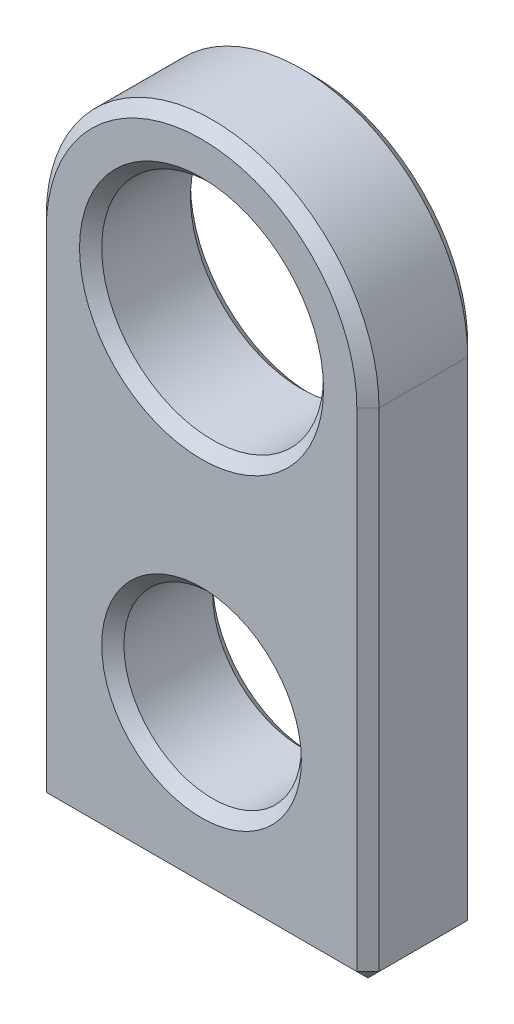
ISO-10303-21;
HEADER;
FILE_DESCRIPTION(('STEP AP214'),'2;1');
FILE_NAME('part.step','',(''),(''),'','','');
FILE_SCHEMA(('AUTOMOTIVE_DESIGN { 1 0 10303 214 1 1 1 1 }'));
ENDSEC;
DATA;
#1=APPLICATION_CONTEXT('core data for automotive mechanical design processes');
#2=APPLICATION_PROTOCOL_DEFINITION('international standard','automotive_design',2000,#1);
#3=PRODUCT_CONTEXT('',#1,'mechanical');
#4=PRODUCT('Part','Part','',(#3));
#5=PRODUCT_RELATED_PRODUCT_CATEGORY('part','',(#4));
#6=PRODUCT_DEFINITION_FORMATION('','',#4);
#7=PRODUCT_DEFINITION_CONTEXT('part definition',#1,'design');
#8=PRODUCT_DEFINITION('design','',#6,#7);
#9=PRODUCT_DEFINITION_SHAPE('','',#8);
#10=(LENGTH_UNIT() NAMED_UNIT(*) SI_UNIT(.MILLI.,.METRE.));
#11=(NAMED_UNIT(*) PLANE_ANGLE_UNIT() SI_UNIT($,.RADIAN.));
#12=(NAMED_UNIT(*) SI_UNIT($,.STERADIAN.) SOLID_ANGLE_UNIT());
#13=UNCERTAINTY_MEASURE_WITH_UNIT(LENGTH_MEASURE(1.E-05),#10,'distance_accuracy_value','');
#14=(GEOMETRIC_REPRESENTATION_CONTEXT(3) GLOBAL_UNCERTAINTY_ASSIGNED_CONTEXT((#13)) GLOBAL_UNIT_ASSIGNED_CONTEXT((#10,
#11,#12)) REPRESENTATION_CONTEXT('',''));
#15=CARTESIAN_POINT('',(0.,0.,0.));
#16=DIRECTION('',(0.,0.,1.));
#17=DIRECTION('',(1.,0.,0.));
#18=AXIS2_PLACEMENT_3D('',#15,#16,#17);
#19=CARTESIAN_POINT('',(0.,-60.0355059831991,0.));
#20=DIRECTION('',(-1.,0.,0.));
#21=DIRECTION('',(0.,0.,1.));
#22=AXIS2_PLACEMENT_3D('',#19,#20,#21);
#23=PLANE('',#22);
#24=DIRECTION('',(0.,-1.,0.));
#25=VECTOR('',#24,1.);
#26=CARTESIAN_POINT('',(0.,-61.1738801234898,4.5));
#27=LINE('',#26,#25);
#28=CARTESIAN_POINT('',(0.,-52.5355059831991,4.5));
#29=VERTEX_POINT('',#28);
#30=CARTESIAN_POINT('',(0.,-74.5355059831991,4.5));
#31=VERTEX_POINT('',#30);
#32=EDGE_CURVE('E205',#29,#31,#27,.T.);
#33=ORIENTED_EDGE('',*,*,#32,.F.);
#34=DIRECTION('',(0.,0.,1.));
#35=VECTOR('',#34,1.);
#36=CARTESIAN_POINT('',(0.,-52.5355059831991,0.));
#37=LINE('',#36,#35);
#38=CARTESIAN_POINT('',(0.,-52.5355059831991,0.5));
#39=VERTEX_POINT('',#38);
#40=EDGE_CURVE('E279',#39,#29,#37,.T.);
#41=ORIENTED_EDGE('',*,*,#40,.F.);
#42=DIRECTION('',(0.,1.,0.));
#43=VECTOR('',#42,1.);
#44=CARTESIAN_POINT('',(0.,-61.1738801234898,0.5));
#45=LINE('',#44,#43);
#46=CARTESIAN_POINT('',(0.,-74.5355059831991,0.5));
#47=VERTEX_POINT('',#46);
#48=EDGE_CURVE('E230',#47,#39,#45,.T.);
#49=ORIENTED_EDGE('',*,*,#48,.F.);
#50=DIRECTION('',(0.,0.,-1.));
#51=VECTOR('',#50,1.);
#52=CARTESIAN_POINT('',(0.,-74.5355059831991,0.));
#53=LINE('',#52,#51);
#54=EDGE_CURVE('E246',#31,#47,#53,.T.);
#55=ORIENTED_EDGE('',*,*,#54,.F.);
#56=EDGE_LOOP('',(#33,#41,#49,#55));
#57=FACE_BOUND('',#56,.T.);
#58=ADVANCED_FACE('F17',(#57),#23,.T.);
#59=CARTESIAN_POINT('',(7.5,-52.5355059831991,4.75));
#60=DIRECTION('',(0.,0.,1.));
#61=DIRECTION('',(-1.,0.,0.));
#62=AXIS2_PLACEMENT_3D('',#59,#60,#61);
#63=CONICAL_SURFACE('',#62,5.25,0.7853981634);
#64=CARTESIAN_POINT('',(7.5,-52.5355059831991,5.));
#65=DIRECTION('',(0.,0.,1.));
#66=DIRECTION('',(-1.,0.,0.));
#67=AXIS2_PLACEMENT_3D('',#64,#65,#66);
#68=CIRCLE('',#67,5.5);
#69=CARTESIAN_POINT('',(13.,-52.5355059831991,5.));
#70=VERTEX_POINT('',#69);
#71=EDGE_CURVE('E306',#70,#70,#68,.T.);
#72=ORIENTED_EDGE('',*,*,#71,.T.);
#73=EDGE_LOOP('',(#72));
#74=FACE_BOUND('',#73,.T.);
#75=CARTESIAN_POINT('',(7.5,-52.5355059831991,4.5));
#76=DIRECTION('',(0.,0.,-1.));
#77=DIRECTION('',(-1.,0.,0.));
#78=AXIS2_PLACEMENT_3D('',#75,#76,#77);
#79=CIRCLE('',#78,5.);
#80=CARTESIAN_POINT('',(12.5,-52.5355059831991,4.5));
#81=VERTEX_POINT('',#80);
#82=EDGE_CURVE('E11',#81,#81,#79,.T.);
#83=ORIENTED_EDGE('',*,*,#82,.T.);
#84=EDGE_LOOP('',(#83));
#85=FACE_BOUND('',#84,.T.);
#86=ADVANCED_FACE('F340',(#74,#85),#63,.F.);
#87=CARTESIAN_POINT('',(7.5,-52.5355059831991,0.));
#88=DIRECTION('',(0.,0.,1.));
#89=DIRECTION('',(-1.,0.,0.));
#90=AXIS2_PLACEMENT_3D('',#87,#88,#89);
#91=CYLINDRICAL_SURFACE('',#90,5.);
#92=CARTESIAN_POINT('',(7.5,-52.5355059831991,0.5));
#93=DIRECTION('',(0.,0.,1.));
#94=DIRECTION('',(-1.,0.,0.));
#95=AXIS2_PLACEMENT_3D('',#92,#93,#94);
#96=CIRCLE('',#95,5.);
#97=CARTESIAN_POINT('',(12.5,-52.5355059831991,0.5));
#98=VERTEX_POINT('',#97);
#99=EDGE_CURVE('E25',#98,#98,#96,.T.);
#100=ORIENTED_EDGE('',*,*,#99,.F.);
#101=EDGE_LOOP('',(#100));
#102=FACE_BOUND('',#101,.T.);
#103=ORIENTED_EDGE('',*,*,#82,.F.);
#104=EDGE_LOOP('',(#103));
#105=FACE_BOUND('',#104,.T.);
#106=ADVANCED_FACE('F346',(#102,#105),#91,.F.);
#107=CARTESIAN_POINT('',(7.5,-52.5355059831991,0.25));
#108=DIRECTION('',(0.,0.,-1.));
#109=DIRECTION('',(-1.,0.,0.));
#110=AXIS2_PLACEMENT_3D('',#107,#108,#109);
#111=CONICAL_SURFACE('',#110,5.25,0.7853981634);
#112=CARTESIAN_POINT('',(7.5,-52.5355059831991,0.));
#113=DIRECTION('',(0.,0.,-1.));
#114=DIRECTION('',(-1.,0.,0.));
#115=AXIS2_PLACEMENT_3D('',#112,#113,#114);
#116=CIRCLE('',#115,5.5);
#117=CARTESIAN_POINT('',(13.,-52.5355059831991,0.));
#118=VERTEX_POINT('',#117);
#119=EDGE_CURVE('E278',#118,#118,#116,.T.);
#120=ORIENTED_EDGE('',*,*,#119,.T.);
#121=EDGE_LOOP('',(#120));
#122=FACE_BOUND('',#121,.T.);
#123=ORIENTED_EDGE('',*,*,#99,.T.);
#124=EDGE_LOOP('',(#123));
#125=FACE_BOUND('',#124,.T.);
#126=ADVANCED_FACE('F335',(#122,#125),#111,.F.);
#127=CARTESIAN_POINT('',(7.5,-67.5355059831991,4.75));
#128=DIRECTION('',(0.,0.,1.));
#129=DIRECTION('',(-1.,0.,0.));
#130=AXIS2_PLACEMENT_3D('',#127,#128,#129);
#131=CONICAL_SURFACE('',#130,4.25,0.7853981634);
#132=CARTESIAN_POINT('',(7.5,-67.5355059831991,5.));
#133=DIRECTION('',(0.,0.,1.));
#134=DIRECTION('',(-1.,0.,0.));
#135=AXIS2_PLACEMENT_3D('',#132,#133,#134);
#136=CIRCLE('',#135,4.5);
#137=CARTESIAN_POINT('',(12.,-67.5355059831991,5.));
#138=VERTEX_POINT('',#137);
#139=EDGE_CURVE('E303',#138,#138,#136,.T.);
#140=ORIENTED_EDGE('',*,*,#139,.T.);
#141=EDGE_LOOP('',(#140));
#142=FACE_BOUND('',#141,.T.);
#143=CARTESIAN_POINT('',(7.5,-67.5355059831991,4.5));
#144=DIRECTION('',(0.,0.,-1.));
#145=DIRECTION('',(-1.,0.,0.));
#146=AXIS2_PLACEMENT_3D('',#143,#144,#145);
#147=CIRCLE('',#146,4.);
#148=CARTESIAN_POINT('',(11.5,-67.5355059831991,4.5));
#149=VERTEX_POINT('',#148);
#150=EDGE_CURVE('E199',#149,#149,#147,.T.);
#151=ORIENTED_EDGE('',*,*,#150,.T.);
#152=EDGE_LOOP('',(#151));
#153=FACE_BOUND('',#152,.T.);
#154=ADVANCED_FACE('F319',(#142,#153),#131,.F.);
#155=CARTESIAN_POINT('',(7.5,-67.5355059831991,0.));
#156=DIRECTION('',(0.,0.,1.));
#157=DIRECTION('',(-1.,0.,0.));
#158=AXIS2_PLACEMENT_3D('',#155,#156,#157);
#159=CYLINDRICAL_SURFACE('',#158,4.);
#160=CARTESIAN_POINT('',(7.5,-67.5355059831991,0.5));
#161=DIRECTION('',(0.,0.,1.));
#162=DIRECTION('',(-1.,0.,0.));
#163=AXIS2_PLACEMENT_3D('',#160,#161,#162);
#164=CIRCLE('',#163,4.);
#165=CARTESIAN_POINT('',(11.5,-67.5355059831991,0.5));
#166=VERTEX_POINT('',#165);
#167=EDGE_CURVE('E309',#166,#166,#164,.T.);
#168=ORIENTED_EDGE('',*,*,#167,.F.);
#169=EDGE_LOOP('',(#168));
#170=FACE_BOUND('',#169,.T.);
#171=ORIENTED_EDGE('',*,*,#150,.F.);
#172=EDGE_LOOP('',(#171));
#173=FACE_BOUND('',#172,.T.);
#174=ADVANCED_FACE('F321',(#170,#173),#159,.F.);
#175=CARTESIAN_POINT('',(7.5,-67.5355059831991,0.25));
#176=DIRECTION('',(0.,0.,-1.));
#177=DIRECTION('',(-1.,0.,0.));
#178=AXIS2_PLACEMENT_3D('',#175,#176,#177);
#179=CONICAL_SURFACE('',#178,4.25,0.7853981634);
#180=CARTESIAN_POINT('',(7.5,-67.5355059831991,0.));
#181=DIRECTION('',(0.,0.,-1.));
#182=DIRECTION('',(-1.,0.,0.));
#183=AXIS2_PLACEMENT_3D('',#180,#181,#182);
#184=CIRCLE('',#183,4.5);
#185=CARTESIAN_POINT('',(12.,-67.5355059831991,0.));
#186=VERTEX_POINT('',#185);
#187=EDGE_CURVE('E275',#186,#186,#184,.T.);
#188=ORIENTED_EDGE('',*,*,#187,.T.);
#189=EDGE_LOOP('',(#188));
#190=FACE_BOUND('',#189,.T.);
#191=ORIENTED_EDGE('',*,*,#167,.T.);
#192=EDGE_LOOP('',(#191));
#193=FACE_BOUND('',#192,.T.);
#194=ADVANCED_FACE('F323',(#190,#193),#179,.F.);
#195=CARTESIAN_POINT('',(7.5,-62.3122542637806,5.));
#196=DIRECTION('',(0.,0.,1.));
#197=DIRECTION('',(1.,0.,0.));
#198=AXIS2_PLACEMENT_3D('',#195,#196,#197);
#199=PLANE('',#198);
#200=ORIENTED_EDGE('',*,*,#71,.F.);
#201=EDGE_LOOP('',(#200));
#202=FACE_BOUND('',#201,.T.);
#203=ORIENTED_EDGE('',*,*,#139,.F.);
#204=EDGE_LOOP('',(#203));
#205=FACE_BOUND('',#204,.T.);
#206=DIRECTION('',(0.,-1.,0.));
#207=VECTOR('',#206,1.);
#208=CARTESIAN_POINT('',(14.5,-68.6738801234898,5.));
#209=LINE('',#208,#207);
#210=CARTESIAN_POINT('',(14.5,-52.5355059831991,5.));
#211=VERTEX_POINT('',#210);
#212=CARTESIAN_POINT('',(14.5,-74.5355059831991,5.));
#213=VERTEX_POINT('',#212);
#214=EDGE_CURVE('E268',#211,#213,#209,.T.);
#215=ORIENTED_EDGE('',*,*,#214,.F.);
#216=CARTESIAN_POINT('',(7.5,-52.5355059831991,5.));
#217=DIRECTION('',(0.,0.,-1.));
#218=DIRECTION('',(1.,0.,0.));
#219=AXIS2_PLACEMENT_3D('',#216,#217,#218);
#220=CIRCLE('',#219,7.);
#221=CARTESIAN_POINT('',(0.5,-52.5355059831991,5.));
#222=VERTEX_POINT('',#221);
#223=EDGE_CURVE('E206',#222,#211,#220,.T.);
#224=ORIENTED_EDGE('',*,*,#223,.F.);
#225=DIRECTION('',(0.,1.,0.));
#226=VECTOR('',#225,1.);
#227=CARTESIAN_POINT('',(0.5,-61.1738801234898,5.));
#228=LINE('',#227,#226);
#229=CARTESIAN_POINT('',(0.5,-74.5355059831991,5.));
#230=VERTEX_POINT('',#229);
#231=EDGE_CURVE('E287',#230,#222,#228,.T.);
#232=ORIENTED_EDGE('',*,*,#231,.F.);
#233=DIRECTION('',(-1.,0.,0.));
#234=VECTOR('',#233,1.);
#235=CARTESIAN_POINT('',(3.75,-74.5355059831991,5.));
#236=LINE('',#235,#234);
#237=EDGE_CURVE('E290',#213,#230,#236,.T.);
#238=ORIENTED_EDGE('',*,*,#237,.F.);
#239=EDGE_LOOP('',(#215,#224,#232,#238));
#240=FACE_BOUND('',#239,.T.);
#241=ADVANCED_FACE('F332',(#202,#205,#240),#199,.T.);
#242=CARTESIAN_POINT('',(0.,-75.0355059831991,0.));
#243=DIRECTION('',(0.,-1.,0.));
#244=DIRECTION('',(0.,0.,-1.));
#245=AXIS2_PLACEMENT_3D('',#242,#243,#244);
#246=PLANE('',#245);
#247=DIRECTION('',(-1.,0.,0.));
#248=VECTOR('',#247,1.);
#249=CARTESIAN_POINT('',(3.75,-75.0355059831991,0.5));
#250=LINE('',#249,#248);
#251=CARTESIAN_POINT('',(14.5,-75.0355059831991,0.5));
#252=VERTEX_POINT('',#251);
#253=CARTESIAN_POINT('',(0.5,-75.0355059831991,0.5));
#254=VERTEX_POINT('',#253);
#255=EDGE_CURVE('E181',#252,#254,#250,.T.);
#256=ORIENTED_EDGE('',*,*,#255,.F.);
#257=DIRECTION('',(0.,0.,-1.));
#258=VECTOR('',#257,1.);
#259=CARTESIAN_POINT('',(14.5,-75.0355059831991,0.));
#260=LINE('',#259,#258);
#261=CARTESIAN_POINT('',(14.5,-75.0355059831991,4.5));
#262=VERTEX_POINT('',#261);
#263=EDGE_CURVE('E160',#262,#252,#260,.T.);
#264=ORIENTED_EDGE('',*,*,#263,.F.);
#265=DIRECTION('',(1.,0.,0.));
#266=VECTOR('',#265,1.);
#267=CARTESIAN_POINT('',(3.75,-75.0355059831991,4.5));
#268=LINE('',#267,#266);
#269=CARTESIAN_POINT('',(0.5,-75.0355059831991,4.5));
#270=VERTEX_POINT('',#269);
#271=EDGE_CURVE('E293',#270,#262,#268,.T.);
#272=ORIENTED_EDGE('',*,*,#271,.F.);
#273=DIRECTION('',(0.,0.,1.));
#274=VECTOR('',#273,1.);
#275=CARTESIAN_POINT('',(0.5,-75.0355059831991,0.));
#276=LINE('',#275,#274);
#277=EDGE_CURVE('E249',#254,#270,#276,.T.);
#278=ORIENTED_EDGE('',*,*,#277,.F.);
#279=EDGE_LOOP('',(#256,#264,#272,#278));
#280=FACE_BOUND('',#279,.T.);
#281=ADVANCED_FACE('F376',(#280),#246,.T.);
#282=CARTESIAN_POINT('',(7.5,-62.3122542637806,0.));
#283=DIRECTION('',(0.,0.,1.));
#284=DIRECTION('',(1.,0.,0.));
#285=AXIS2_PLACEMENT_3D('',#282,#283,#284);
#286=PLANE('',#285);
#287=ORIENTED_EDGE('',*,*,#119,.F.);
#288=EDGE_LOOP('',(#287));
#289=FACE_BOUND('',#288,.T.);
#290=ORIENTED_EDGE('',*,*,#187,.F.);
#291=EDGE_LOOP('',(#290));
#292=FACE_BOUND('',#291,.T.);
#293=DIRECTION('',(1.,0.,0.));
#294=VECTOR('',#293,1.);
#295=CARTESIAN_POINT('',(3.75,-74.5355059831991,0.));
#296=LINE('',#295,#294);
#297=CARTESIAN_POINT('',(0.5,-74.5355059831991,0.));
#298=VERTEX_POINT('',#297);
#299=CARTESIAN_POINT('',(14.5,-74.5355059831991,0.));
#300=VERTEX_POINT('',#299);
#301=EDGE_CURVE('E213',#298,#300,#296,.T.);
#302=ORIENTED_EDGE('',*,*,#301,.F.);
#303=DIRECTION('',(0.,-1.,0.));
#304=VECTOR('',#303,1.);
#305=CARTESIAN_POINT('',(0.5,-61.1738801234898,0.));
#306=LINE('',#305,#304);
#307=CARTESIAN_POINT('',(0.5,-52.5355059831991,0.));
#308=VERTEX_POINT('',#307);
#309=EDGE_CURVE('E227',#308,#298,#306,.T.);
#310=ORIENTED_EDGE('',*,*,#309,.F.);
#311=CARTESIAN_POINT('',(7.5,-52.5355059831991,0.));
#312=DIRECTION('',(0.,0.,1.));
#313=DIRECTION('',(1.,0.,0.));
#314=AXIS2_PLACEMENT_3D('',#311,#312,#313);
#315=CIRCLE('',#314,7.);
#316=CARTESIAN_POINT('',(14.5,-52.5355059831991,0.));
#317=VERTEX_POINT('',#316);
#318=EDGE_CURVE('E222',#317,#308,#315,.T.);
#319=ORIENTED_EDGE('',*,*,#318,.F.);
#320=DIRECTION('',(0.,1.,0.));
#321=VECTOR('',#320,1.);
#322=CARTESIAN_POINT('',(14.5,-68.6738801234898,0.));
#323=LINE('',#322,#321);
#324=EDGE_CURVE('E172',#300,#317,#323,.T.);
#325=ORIENTED_EDGE('',*,*,#324,.F.);
#326=EDGE_LOOP('',(#302,#310,#319,#325));
#327=FACE_BOUND('',#326,.T.);
#328=ADVANCED_FACE('F383',(#289,#292,#327),#286,.F.);
#329=CARTESIAN_POINT('',(7.5,-52.5355059831991,0.));
#330=DIRECTION('',(0.,0.,1.));
#331=DIRECTION('',(1.,0.,0.));
#332=AXIS2_PLACEMENT_3D('',#329,#330,#331);
#333=CYLINDRICAL_SURFACE('',#332,7.5);
#334=CARTESIAN_POINT('',(7.5,-52.5355059831991,4.5));
#335=DIRECTION('',(0.,0.,1.));
#336=DIRECTION('',(1.,0.,0.));
#337=AXIS2_PLACEMENT_3D('',#334,#335,#336);
#338=CIRCLE('',#337,7.5);
#339=CARTESIAN_POINT('',(15.,-52.5355059831991,4.5));
#340=VERTEX_POINT('',#339);
#341=EDGE_CURVE('E201',#340,#29,#338,.T.);
#342=ORIENTED_EDGE('',*,*,#341,.F.);
#343=DIRECTION('',(0.,0.,1.));
#344=VECTOR('',#343,1.);
#345=CARTESIAN_POINT('',(15.,-52.5355059831991,0.));
#346=LINE('',#345,#344);
#347=CARTESIAN_POINT('',(15.,-52.5355059831991,0.5));
#348=VERTEX_POINT('',#347);
#349=EDGE_CURVE('E296',#348,#340,#346,.T.);
#350=ORIENTED_EDGE('',*,*,#349,.F.);
#351=CARTESIAN_POINT('',(7.5,-52.5355059831991,0.5));
#352=DIRECTION('',(0.,0.,-1.));
#353=DIRECTION('',(1.,0.,0.));
#354=AXIS2_PLACEMENT_3D('',#351,#352,#353);
#355=CIRCLE('',#354,7.5);
#356=EDGE_CURVE('E219',#39,#348,#355,.T.);
#357=ORIENTED_EDGE('',*,*,#356,.F.);
#358=ORIENTED_EDGE('',*,*,#40,.T.);
#359=EDGE_LOOP('',(#342,#350,#357,#358));
#360=FACE_BOUND('',#359,.T.);
#361=ADVANCED_FACE('F389',(#360),#333,.T.);
#362=CARTESIAN_POINT('',(15.,-75.0355059831991,0.));
#363=DIRECTION('',(1.,0.,0.));
#364=DIRECTION('',(0.,1.,0.));
#365=AXIS2_PLACEMENT_3D('',#362,#363,#364);
#366=PLANE('',#365);
#367=DIRECTION('',(0.,1.,0.));
#368=VECTOR('',#367,1.);
#369=CARTESIAN_POINT('',(15.,-68.6738801234898,4.5));
#370=LINE('',#369,#368);
#371=CARTESIAN_POINT('',(15.,-74.5355059831991,4.5));
#372=VERTEX_POINT('',#371);
#373=EDGE_CURVE('E153',#372,#340,#370,.T.);
#374=ORIENTED_EDGE('',*,*,#373,.F.);
#375=DIRECTION('',(0.,0.,1.));
#376=VECTOR('',#375,1.);
#377=CARTESIAN_POINT('',(15.,-74.5355059831991,0.));
#378=LINE('',#377,#376);
#379=CARTESIAN_POINT('',(15.,-74.5355059831991,0.5));
#380=VERTEX_POINT('',#379);
#381=EDGE_CURVE('E147',#380,#372,#378,.T.);
#382=ORIENTED_EDGE('',*,*,#381,.F.);
#383=DIRECTION('',(0.,-1.,0.));
#384=VECTOR('',#383,1.);
#385=CARTESIAN_POINT('',(15.,-68.6738801234898,0.5));
#386=LINE('',#385,#384);
#387=EDGE_CURVE('E150',#348,#380,#386,.T.);
#388=ORIENTED_EDGE('',*,*,#387,.F.);
#389=ORIENTED_EDGE('',*,*,#349,.T.);
#390=EDGE_LOOP('',(#374,#382,#388,#389));
#391=FACE_BOUND('',#390,.T.);
#392=ADVANCED_FACE('F149',(#391),#366,.T.);
#393=CARTESIAN_POINT('',(3.75,-74.7855059831991,4.75));
#394=DIRECTION('',(0.,-0.707106781186549,0.707106781186546));
#395=DIRECTION('',(-1.,0.,0.));
#396=AXIS2_PLACEMENT_3D('',#393,#394,#395);
#397=PLANE('',#396);
#398=DIRECTION('',(0.,0.707106781186546,0.707106781186549));
#399=VECTOR('',#398,1.);
#400=CARTESIAN_POINT('',(14.5,-75.0355059831991,4.5));
#401=LINE('',#400,#399);
#402=EDGE_CURVE('E253',#262,#213,#401,.T.);
#403=ORIENTED_EDGE('',*,*,#402,.T.);
#404=ORIENTED_EDGE('',*,*,#237,.T.);
#405=DIRECTION('',(0.,-0.707106781186546,-0.707106781186549));
#406=VECTOR('',#405,1.);
#407=CARTESIAN_POINT('',(0.5,-74.5355059831991,5.));
#408=LINE('',#407,#406);
#409=EDGE_CURVE('E242',#230,#270,#408,.T.);
#410=ORIENTED_EDGE('',*,*,#409,.T.);
#411=ORIENTED_EDGE('',*,*,#271,.T.);
#412=EDGE_LOOP('',(#403,#404,#410,#411));
#413=FACE_BOUND('',#412,.T.);
#414=ADVANCED_FACE('F373',(#413),#397,.T.);
#415=CARTESIAN_POINT('',(0.25,-61.1738801234898,4.75));
#416=DIRECTION('',(-0.707106781186548,0.,0.707106781186548));
#417=DIRECTION('',(0.,1.,0.));
#418=AXIS2_PLACEMENT_3D('',#415,#416,#417);
#419=PLANE('',#418);
#420=DIRECTION('',(0.707106781186546,0.,0.707106781186549));
#421=VECTOR('',#420,1.);
#422=CARTESIAN_POINT('',(0.,-52.5355059831991,4.5));
#423=LINE('',#422,#421);
#424=EDGE_CURVE('E274',#29,#222,#423,.T.);
#425=ORIENTED_EDGE('',*,*,#424,.F.);
#426=ORIENTED_EDGE('',*,*,#32,.T.);
#427=DIRECTION('',(0.707106781186548,0.,0.707106781186548));
#428=VECTOR('',#427,1.);
#429=CARTESIAN_POINT('',(0.,-74.5355059831991,4.5));
#430=LINE('',#429,#428);
#431=EDGE_CURVE('E234',#31,#230,#430,.T.);
#432=ORIENTED_EDGE('',*,*,#431,.T.);
#433=ORIENTED_EDGE('',*,*,#231,.T.);
#434=EDGE_LOOP('',(#425,#426,#432,#433));
#435=FACE_BOUND('',#434,.T.);
#436=ADVANCED_FACE('F358',(#435),#419,.T.);
#437=CARTESIAN_POINT('',(7.5,-52.5355059831991,4.75));
#438=DIRECTION('',(0.,0.,-1.));
#439=DIRECTION('',(1.,0.,0.));
#440=AXIS2_PLACEMENT_3D('',#437,#438,#439);
#441=CONICAL_SURFACE('',#440,7.25,0.785398163399998);
#442=ORIENTED_EDGE('',*,*,#424,.T.);
#443=ORIENTED_EDGE('',*,*,#223,.T.);
#444=DIRECTION('',(-0.707106781186548,0.,0.707106781186547));
#445=VECTOR('',#444,1.);
#446=CARTESIAN_POINT('',(15.,-52.5355059831991,4.5));
#447=LINE('',#446,#445);
#448=EDGE_CURVE('E159',#340,#211,#447,.T.);
#449=ORIENTED_EDGE('',*,*,#448,.F.);
#450=ORIENTED_EDGE('',*,*,#341,.T.);
#451=EDGE_LOOP('',(#442,#443,#449,#450));
#452=FACE_BOUND('',#451,.T.);
#453=ADVANCED_FACE('F356',(#452),#441,.T.);
#454=CARTESIAN_POINT('',(14.75,-68.6738801234898,4.75));
#455=DIRECTION('',(0.707106781186547,0.,0.707106781186548));
#456=DIRECTION('',(0.,-1.,0.));
#457=AXIS2_PLACEMENT_3D('',#454,#455,#456);
#458=PLANE('',#457);
#459=ORIENTED_EDGE('',*,*,#448,.T.);
#460=ORIENTED_EDGE('',*,*,#214,.T.);
#461=DIRECTION('',(0.707106781186548,0.,-0.707106781186547));
#462=VECTOR('',#461,1.);
#463=CARTESIAN_POINT('',(14.5,-74.5355059831991,5.));
#464=LINE('',#463,#462);
#465=EDGE_CURVE('E259',#213,#372,#464,.T.);
#466=ORIENTED_EDGE('',*,*,#465,.T.);
#467=ORIENTED_EDGE('',*,*,#373,.T.);
#468=EDGE_LOOP('',(#459,#460,#466,#467));
#469=FACE_BOUND('',#468,.T.);
#470=ADVANCED_FACE('F367',(#469),#458,.T.);
#471=CARTESIAN_POINT('',(14.75,-74.7855059831991,0.));
#472=DIRECTION('',(0.707106781186546,-0.707106781186549,0.));
#473=DIRECTION('',(0.,0.,-1.));
#474=AXIS2_PLACEMENT_3D('',#471,#472,#473);
#475=PLANE('',#474);
#476=DIRECTION('',(-0.707106781186549,-0.707106781186546,0.));
#477=VECTOR('',#476,1.);
#478=CARTESIAN_POINT('',(15.,-74.5355059831991,4.5));
#479=LINE('',#478,#477);
#480=EDGE_CURVE('E257',#372,#262,#479,.T.);
#481=ORIENTED_EDGE('',*,*,#480,.T.);
#482=ORIENTED_EDGE('',*,*,#263,.T.);
#483=DIRECTION('',(0.707106781186549,0.707106781186546,0.));
#484=VECTOR('',#483,1.);
#485=CARTESIAN_POINT('',(14.5,-75.0355059831991,0.5));
#486=LINE('',#485,#484);
#487=EDGE_CURVE('E177',#252,#380,#486,.T.);
#488=ORIENTED_EDGE('',*,*,#487,.T.);
#489=ORIENTED_EDGE('',*,*,#381,.T.);
#490=EDGE_LOOP('',(#481,#482,#488,#489));
#491=FACE_BOUND('',#490,.T.);
#492=ADVANCED_FACE('F183',(#491),#475,.T.);
#493=CARTESIAN_POINT('',(15.,-74.5355059831991,4.5));
#494=DIRECTION('',(0.577350269189625,-0.577350269189627,0.577350269189625));
#495=DIRECTION('',(0.,-0.707106781186546,-0.707106781186549));
#496=AXIS2_PLACEMENT_3D('',#493,#494,#495);
#497=PLANE('',#496);
#498=ORIENTED_EDGE('',*,*,#402,.F.);
#499=ORIENTED_EDGE('',*,*,#480,.F.);
#500=ORIENTED_EDGE('',*,*,#465,.F.);
#501=EDGE_LOOP('',(#498,#499,#500));
#502=FACE_BOUND('',#501,.T.);
#503=ADVANCED_FACE('F371',(#502),#497,.T.);
#504=CARTESIAN_POINT('',(0.25,-74.7855059831991,0.));
#505=DIRECTION('',(-0.707106781186546,-0.707106781186549,0.));
#506=DIRECTION('',(-0.707106781186549,0.707106781186546,0.));
#507=AXIS2_PLACEMENT_3D('',#504,#505,#506);
#508=PLANE('',#507);
#509=DIRECTION('',(-0.707106781186549,0.707106781186546,0.));
#510=VECTOR('',#509,1.);
#511=CARTESIAN_POINT('',(0.5,-75.0355059831991,4.5));
#512=LINE('',#511,#510);
#513=EDGE_CURVE('E238',#270,#31,#512,.T.);
#514=ORIENTED_EDGE('',*,*,#513,.T.);
#515=ORIENTED_EDGE('',*,*,#54,.T.);
#516=DIRECTION('',(0.707106781186549,-0.707106781186546,0.));
#517=VECTOR('',#516,1.);
#518=CARTESIAN_POINT('',(0.,-74.5355059831991,0.5));
#519=LINE('',#518,#517);
#520=EDGE_CURVE('E770',#47,#254,#519,.T.);
#521=ORIENTED_EDGE('',*,*,#520,.T.);
#522=ORIENTED_EDGE('',*,*,#277,.T.);
#523=EDGE_LOOP('',(#514,#515,#521,#522));
#524=FACE_BOUND('',#523,.T.);
#525=ADVANCED_FACE('F412',(#524),#508,.T.);
#526=CARTESIAN_POINT('',(0.5,-75.0355059831991,4.5));
#527=DIRECTION('',(-0.577350269189625,-0.577350269189627,0.577350269189625));
#528=DIRECTION('',(-0.707106781186549,0.707106781186546,0.));
#529=AXIS2_PLACEMENT_3D('',#526,#527,#528);
#530=PLANE('',#529);
#531=ORIENTED_EDGE('',*,*,#431,.F.);
#532=ORIENTED_EDGE('',*,*,#513,.F.);
#533=ORIENTED_EDGE('',*,*,#409,.F.);
#534=EDGE_LOOP('',(#531,#532,#533));
#535=FACE_BOUND('',#534,.T.);
#536=ADVANCED_FACE('F408',(#535),#530,.T.);
#537=CARTESIAN_POINT('',(0.25,-61.1738801234898,0.25));
#538=DIRECTION('',(-0.707106781186547,0.,-0.707106781186548));
#539=DIRECTION('',(-0.707106781186548,0.,0.707106781186547));
#540=AXIS2_PLACEMENT_3D('',#537,#538,#539);
#541=PLANE('',#540);
#542=DIRECTION('',(-0.707106781186546,0.,0.707106781186549));
#543=VECTOR('',#542,1.);
#544=CARTESIAN_POINT('',(0.5,-52.5355059831991,0.));
#545=LINE('',#544,#543);
#546=EDGE_CURVE('E209',#308,#39,#545,.T.);
#547=ORIENTED_EDGE('',*,*,#546,.F.);
#548=ORIENTED_EDGE('',*,*,#309,.T.);
#549=DIRECTION('',(-0.707106781186548,0.,0.707106781186547));
#550=VECTOR('',#549,1.);
#551=CARTESIAN_POINT('',(0.5,-74.5355059831991,0.));
#552=LINE('',#551,#550);
#553=EDGE_CURVE('E196',#298,#47,#552,.T.);
#554=ORIENTED_EDGE('',*,*,#553,.T.);
#555=ORIENTED_EDGE('',*,*,#48,.T.);
#556=EDGE_LOOP('',(#547,#548,#554,#555));
#557=FACE_BOUND('',#556,.T.);
#558=ADVANCED_FACE('F405',(#557),#541,.T.);
#559=CARTESIAN_POINT('',(7.5,-52.5355059831991,0.25));
#560=DIRECTION('',(0.,0.,1.));
#561=DIRECTION('',(1.,0.,0.));
#562=AXIS2_PLACEMENT_3D('',#559,#560,#561);
#563=CONICAL_SURFACE('',#562,7.25,0.785398163399998);
#564=ORIENTED_EDGE('',*,*,#546,.T.);
#565=ORIENTED_EDGE('',*,*,#356,.T.);
#566=DIRECTION('',(0.707106781186548,0.,0.707106781186547));
#567=VECTOR('',#566,1.);
#568=CARTESIAN_POINT('',(14.5,-52.5355059831991,0.));
#569=LINE('',#568,#567);
#570=EDGE_CURVE('E170',#317,#348,#569,.T.);
#571=ORIENTED_EDGE('',*,*,#570,.F.);
#572=ORIENTED_EDGE('',*,*,#318,.T.);
#573=EDGE_LOOP('',(#564,#565,#571,#572));
#574=FACE_BOUND('',#573,.T.);
#575=ADVANCED_FACE('F386',(#574),#563,.T.);
#576=CARTESIAN_POINT('',(14.75,-68.6738801234898,0.25));
#577=DIRECTION('',(0.707106781186547,0.,-0.707106781186548));
#578=DIRECTION('',(0.,-1.,0.));
#579=AXIS2_PLACEMENT_3D('',#576,#577,#578);
#580=PLANE('',#579);
#581=ORIENTED_EDGE('',*,*,#570,.T.);
#582=ORIENTED_EDGE('',*,*,#387,.T.);
#583=DIRECTION('',(-0.707106781186548,0.,-0.707106781186547));
#584=VECTOR('',#583,1.);
#585=CARTESIAN_POINT('',(15.,-74.5355059831991,0.5));
#586=LINE('',#585,#584);
#587=EDGE_CURVE('E167',#380,#300,#586,.T.);
#588=ORIENTED_EDGE('',*,*,#587,.T.);
#589=ORIENTED_EDGE('',*,*,#324,.T.);
#590=EDGE_LOOP('',(#581,#582,#588,#589));
#591=FACE_BOUND('',#590,.T.);
#592=ADVANCED_FACE('F165',(#591),#580,.T.);
#593=CARTESIAN_POINT('',(3.75,-74.7855059831991,0.25));
#594=DIRECTION('',(0.,-0.707106781186549,-0.707106781186546));
#595=DIRECTION('',(0.,0.707106781186546,-0.707106781186549));
#596=AXIS2_PLACEMENT_3D('',#593,#594,#595);
#597=PLANE('',#596);
#598=DIRECTION('',(0.,-0.707106781186546,0.707106781186549));
#599=VECTOR('',#598,1.);
#600=CARTESIAN_POINT('',(14.5,-74.5355059831991,0.));
#601=LINE('',#600,#599);
#602=EDGE_CURVE('E179',#300,#252,#601,.T.);
#603=ORIENTED_EDGE('',*,*,#602,.T.);
#604=ORIENTED_EDGE('',*,*,#255,.T.);
#605=DIRECTION('',(0.,0.707106781186546,-0.707106781186549));
#606=VECTOR('',#605,1.);
#607=CARTESIAN_POINT('',(0.5,-75.0355059831991,0.5));
#608=LINE('',#607,#606);
#609=EDGE_CURVE('E187',#254,#298,#608,.T.);
#610=ORIENTED_EDGE('',*,*,#609,.T.);
#611=ORIENTED_EDGE('',*,*,#301,.T.);
#612=EDGE_LOOP('',(#603,#604,#610,#611));
#613=FACE_BOUND('',#612,.T.);
#614=ADVANCED_FACE('F379',(#613),#597,.T.);
#615=CARTESIAN_POINT('',(14.5,-74.5355059831991,0.));
#616=DIRECTION('',(0.577350269189625,-0.577350269189627,-0.577350269189625));
#617=DIRECTION('',(0.,0.707106781186546,-0.707106781186549));
#618=AXIS2_PLACEMENT_3D('',#615,#616,#617);
#619=PLANE('',#618);
#620=ORIENTED_EDGE('',*,*,#487,.F.);
#621=ORIENTED_EDGE('',*,*,#602,.F.);
#622=ORIENTED_EDGE('',*,*,#587,.F.);
#623=EDGE_LOOP('',(#620,#621,#622));
#624=FACE_BOUND('',#623,.T.);
#625=ADVANCED_FACE('F176',(#624),#619,.T.);
#626=CARTESIAN_POINT('',(0.5,-74.5355059831991,0.));
#627=DIRECTION('',(-0.577350269189625,-0.577350269189627,-0.577350269189626));
#628=DIRECTION('',(0.,0.707106781186547,-0.707106781186548));
#629=AXIS2_PLACEMENT_3D('',#626,#627,#628);
#630=PLANE('',#629);
#631=ORIENTED_EDGE('',*,*,#520,.F.);
#632=ORIENTED_EDGE('',*,*,#553,.F.);
#633=ORIENTED_EDGE('',*,*,#609,.F.);
#634=EDGE_LOOP('',(#631,#632,#633));
#635=FACE_BOUND('',#634,.T.);
#636=ADVANCED_FACE('F608',(#635),#630,.T.);
#637=CLOSED_SHELL('',(#58,#86,#106,#126,#154,#174,#194,#241,#281,#328,#361,#392,#414,#436,#453,
#470,#492,#503,#525,#536,#558,#575,#592,#614,#625,#636));
#638=MANIFOLD_SOLID_BREP('B1',#637);
#639=ADVANCED_BREP_SHAPE_REPRESENTATION('',(#18,#638),#14);
#640=SHAPE_DEFINITION_REPRESENTATION(#9,#639);
ENDSEC;
END-ISO-10303-21;
